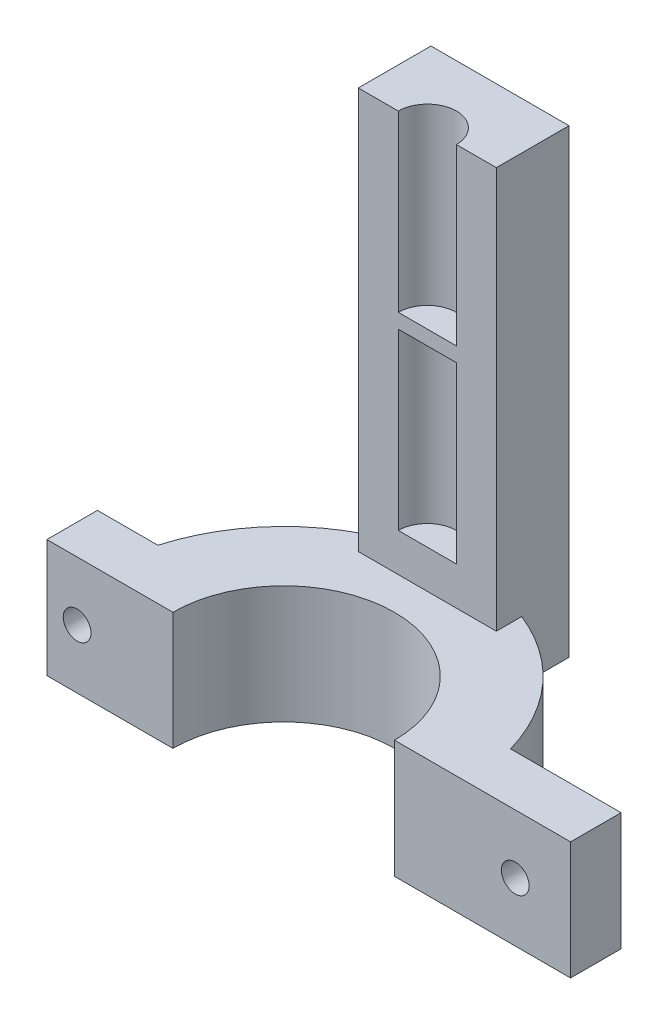
ISO-10303-21;
HEADER;
FILE_DESCRIPTION(('STEP AP214'),'2;1');
FILE_NAME('part.step','',(''),(''),'','','');
FILE_SCHEMA(('AUTOMOTIVE_DESIGN { 1 0 10303 214 1 1 1 1 }'));
ENDSEC;
DATA;
#1=APPLICATION_CONTEXT('core data for automotive mechanical design processes');
#2=APPLICATION_PROTOCOL_DEFINITION('international standard','automotive_design',2000,#1);
#3=PRODUCT_CONTEXT('',#1,'mechanical');
#4=PRODUCT('Part','Part','',(#3));
#5=PRODUCT_RELATED_PRODUCT_CATEGORY('part','',(#4));
#6=PRODUCT_DEFINITION_FORMATION('','',#4);
#7=PRODUCT_DEFINITION_CONTEXT('part definition',#1,'design');
#8=PRODUCT_DEFINITION('design','',#6,#7);
#9=PRODUCT_DEFINITION_SHAPE('','',#8);
#10=(LENGTH_UNIT() NAMED_UNIT(*) SI_UNIT(.MILLI.,.METRE.));
#11=(NAMED_UNIT(*) PLANE_ANGLE_UNIT() SI_UNIT($,.RADIAN.));
#12=(NAMED_UNIT(*) SI_UNIT($,.STERADIAN.) SOLID_ANGLE_UNIT());
#13=UNCERTAINTY_MEASURE_WITH_UNIT(LENGTH_MEASURE(1.E-05),#10,'distance_accuracy_value','');
#14=(GEOMETRIC_REPRESENTATION_CONTEXT(3) GLOBAL_UNCERTAINTY_ASSIGNED_CONTEXT((#13)) GLOBAL_UNIT_ASSIGNED_CONTEXT((#10,
#11,#12)) REPRESENTATION_CONTEXT('',''));
#15=CARTESIAN_POINT('',(0.,0.,0.));
#16=DIRECTION('',(0.,0.,1.));
#17=DIRECTION('',(1.,0.,0.));
#18=AXIS2_PLACEMENT_3D('',#15,#16,#17);
#19=CARTESIAN_POINT('',(-14.35,-74.82,0.));
#20=DIRECTION('',(0.,1.,0.));
#21=DIRECTION('',(0.,0.,1.));
#22=AXIS2_PLACEMENT_3D('',#19,#20,#21);
#23=CYLINDRICAL_SURFACE('',#22,25.25);
#24=CARTESIAN_POINT('',(-14.35,-66.705,0.));
#25=DIRECTION('',(0.,1.,0.));
#26=DIRECTION('',(0.,0.,1.));
#27=AXIS2_PLACEMENT_3D('',#24,#25,#26);
#28=CIRCLE('',#27,25.25);
#29=CARTESIAN_POINT('',(-24.0767539253605,-66.705,-23.3013467008987));
#30=VERTEX_POINT('',#29);
#31=CARTESIAN_POINT('',(-5.07675392536054,-66.705,-23.4855148387082));
#32=VERTEX_POINT('',#31);
#33=EDGE_CURVE('E103',#30,#32,#28,.F.);
#34=ORIENTED_EDGE('',*,*,#33,.T.);
#35=DIRECTION('',(0.,1.,0.));
#36=VECTOR('',#35,1.);
#37=CARTESIAN_POINT('',(-5.07675392536053,-74.82,-23.4855148387082));
#38=LINE('',#37,#36);
#39=CARTESIAN_POINT('',(-5.07675392536054,-58.59,-23.4855148387082));
#40=VERTEX_POINT('',#39);
#41=EDGE_CURVE('E264',#32,#40,#38,.T.);
#42=ORIENTED_EDGE('',*,*,#41,.T.);
#43=CARTESIAN_POINT('',(-14.35,-58.59,0.));
#44=DIRECTION('',(0.,1.,0.));
#45=DIRECTION('',(1.,0.,0.));
#46=AXIS2_PLACEMENT_3D('',#43,#44,#45);
#47=CIRCLE('',#46,25.25);
#48=CARTESIAN_POINT('',(9.92324607463947,-58.59,-6.955));
#49=VERTEX_POINT('',#48);
#50=EDGE_CURVE('E320',#49,#40,#47,.T.);
#51=ORIENTED_EDGE('',*,*,#50,.F.);
#52=DIRECTION('',(0.,1.,0.));
#53=VECTOR('',#52,1.);
#54=CARTESIAN_POINT('',(9.92324607463947,-74.82,-6.95500000000001));
#55=LINE('',#54,#53);
#56=CARTESIAN_POINT('',(9.92324607463947,-74.82,-6.955));
#57=VERTEX_POINT('',#56);
#58=EDGE_CURVE('E319',#57,#49,#55,.T.);
#59=ORIENTED_EDGE('',*,*,#58,.F.);
#60=CARTESIAN_POINT('',(-14.35,-74.82,0.));
#61=DIRECTION('',(0.,1.,0.));
#62=DIRECTION('',(1.,0.,0.));
#63=AXIS2_PLACEMENT_3D('',#60,#61,#62);
#64=CIRCLE('',#63,25.25);
#65=CARTESIAN_POINT('',(-38.6232460746395,-74.82,-6.955));
#66=VERTEX_POINT('',#65);
#67=EDGE_CURVE('E316',#57,#66,#64,.T.);
#68=ORIENTED_EDGE('',*,*,#67,.T.);
#69=DIRECTION('',(0.,1.,0.));
#70=VECTOR('',#69,1.);
#71=CARTESIAN_POINT('',(-38.6232460746395,-74.82,-6.955));
#72=LINE('',#71,#70);
#73=CARTESIAN_POINT('',(-38.6232460746395,-58.59,-6.955));
#74=VERTEX_POINT('',#73);
#75=EDGE_CURVE('E335',#74,#66,#72,.F.);
#76=ORIENTED_EDGE('',*,*,#75,.F.);
#77=CARTESIAN_POINT('',(-24.0767539253605,-58.59,-23.3013467008987));
#78=VERTEX_POINT('',#77);
#79=EDGE_CURVE('E313',#78,#74,#47,.T.);
#80=ORIENTED_EDGE('',*,*,#79,.F.);
#81=DIRECTION('',(0.,1.,0.));
#82=VECTOR('',#81,1.);
#83=CARTESIAN_POINT('',(-24.0767539253605,-74.82,-23.3013467008987));
#84=LINE('',#83,#82);
#85=EDGE_CURVE('E262',#78,#30,#84,.F.);
#86=ORIENTED_EDGE('',*,*,#85,.T.);
#87=EDGE_LOOP('',(#34,#42,#51,#59,#68,#76,#80,#86));
#88=FACE_BOUND('',#87,.T.);
#89=ADVANCED_FACE('F80',(#88),#23,.T.);
#90=CARTESIAN_POINT('',(9.92000000000001,-58.59,-6.955));
#91=DIRECTION('',(0.,-1.,0.));
#92=DIRECTION('',(0.,0.,-1.));
#93=AXIS2_PLACEMENT_3D('',#90,#91,#92);
#94=PLANE('',#93);
#95=DIRECTION('',(0.,0.,-1.));
#96=VECTOR('',#95,1.);
#97=CARTESIAN_POINT('',(-5.07675392536054,-58.59,-6.955));
#98=LINE('',#97,#96);
#99=CARTESIAN_POINT('',(-5.07675392536054,-58.59,-20.));
#100=VERTEX_POINT('',#99);
#101=EDGE_CURVE('E347',#100,#40,#98,.T.);
#102=ORIENTED_EDGE('',*,*,#101,.F.);
#103=DIRECTION('',(1.,0.,0.));
#104=VECTOR('',#103,1.);
#105=CARTESIAN_POINT('',(9.92000000000001,-58.59,-20.));
#106=LINE('',#105,#104);
#107=CARTESIAN_POINT('',(-24.0767539253605,-58.59,-20.));
#108=VERTEX_POINT('',#107);
#109=EDGE_CURVE('E341',#108,#100,#106,.T.);
#110=ORIENTED_EDGE('',*,*,#109,.F.);
#111=DIRECTION('',(0.,0.,1.));
#112=VECTOR('',#111,1.);
#113=CARTESIAN_POINT('',(-24.0767539253605,-58.59,-6.955));
#114=LINE('',#113,#112);
#115=EDGE_CURVE('E344',#78,#108,#114,.T.);
#116=ORIENTED_EDGE('',*,*,#115,.F.);
#117=ORIENTED_EDGE('',*,*,#79,.T.);
#118=DIRECTION('',(1.,0.,0.));
#119=VECTOR('',#118,1.);
#120=CARTESIAN_POINT('',(-50.,-58.59,-6.955));
#121=LINE('',#120,#119);
#122=CARTESIAN_POINT('',(-46.9432460746395,-58.59,-6.955));
#123=VERTEX_POINT('',#122);
#124=EDGE_CURVE('E303',#123,#74,#121,.T.);
#125=ORIENTED_EDGE('',*,*,#124,.F.);
#126=DIRECTION('',(0.,0.,-1.));
#127=VECTOR('',#126,1.);
#128=CARTESIAN_POINT('',(-46.9432460746395,-58.59,25.25));
#129=LINE('',#128,#127);
#130=CARTESIAN_POINT('',(-46.9432460746395,-58.59,0.));
#131=VERTEX_POINT('',#130);
#132=EDGE_CURVE('E300',#131,#123,#129,.T.);
#133=ORIENTED_EDGE('',*,*,#132,.F.);
#134=DIRECTION('',(-1.,0.,0.));
#135=VECTOR('',#134,1.);
#136=CARTESIAN_POINT('',(25.14,-58.59,0.));
#137=LINE('',#136,#135);
#138=CARTESIAN_POINT('',(-29.6,-58.59,0.));
#139=VERTEX_POINT('',#138);
#140=EDGE_CURVE('E266',#139,#131,#137,.T.);
#141=ORIENTED_EDGE('',*,*,#140,.F.);
#142=CARTESIAN_POINT('',(-14.35,-58.59,0.));
#143=DIRECTION('',(0.,1.,0.));
#144=DIRECTION('',(0.,0.,1.));
#145=AXIS2_PLACEMENT_3D('',#142,#143,#144);
#146=CIRCLE('',#145,15.25);
#147=CARTESIAN_POINT('',(0.900000000000007,-58.59,0.));
#148=VERTEX_POINT('',#147);
#149=EDGE_CURVE('E307',#148,#139,#146,.T.);
#150=ORIENTED_EDGE('',*,*,#149,.F.);
#151=CARTESIAN_POINT('',(25.14,-58.59,0.));
#152=VERTEX_POINT('',#151);
#153=EDGE_CURVE('E267',#152,#148,#137,.T.);
#154=ORIENTED_EDGE('',*,*,#153,.F.);
#155=DIRECTION('',(0.,0.,-1.));
#156=VECTOR('',#155,1.);
#157=CARTESIAN_POINT('',(25.14,-58.59,-6.955));
#158=LINE('',#157,#156);
#159=CARTESIAN_POINT('',(25.14,-58.59,-6.955));
#160=VERTEX_POINT('',#159);
#161=EDGE_CURVE('E327',#152,#160,#158,.T.);
#162=ORIENTED_EDGE('',*,*,#161,.T.);
#163=DIRECTION('',(1.,0.,0.));
#164=VECTOR('',#163,1.);
#165=CARTESIAN_POINT('',(9.92000000000001,-58.59,-6.955));
#166=LINE('',#165,#164);
#167=EDGE_CURVE('E329',#49,#160,#166,.T.);
#168=ORIENTED_EDGE('',*,*,#167,.F.);
#169=ORIENTED_EDGE('',*,*,#50,.T.);
#170=EDGE_LOOP('',(#102,#110,#116,#117,#125,#133,#141,#150,#154,#162,#168,#169));
#171=FACE_BOUND('',#170,.T.);
#172=ADVANCED_FACE('F376',(#171),#94,.F.);
#173=CARTESIAN_POINT('',(38.14,5.74573636502059,-6.955));
#174=DIRECTION('',(0.,0.,1.));
#175=DIRECTION('',(0.,-1.,0.));
#176=AXIS2_PLACEMENT_3D('',#173,#174,#175);
#177=PLANE('',#176);
#178=CARTESIAN_POINT('',(17.5248952643869,-66.705,-6.95500000000001));
#179=DIRECTION('',(0.,0.,-1.));
#180=DIRECTION('',(0.,1.,0.));
#181=AXIS2_PLACEMENT_3D('',#178,#179,#180);
#182=CIRCLE('',#181,1.91);
#183=CARTESIAN_POINT('',(17.5248952643869,-64.795,-6.95500000000001));
#184=VERTEX_POINT('',#183);
#185=EDGE_CURVE('E324',#184,#184,#182,.T.);
#186=ORIENTED_EDGE('',*,*,#185,.F.);
#187=EDGE_LOOP('',(#186));
#188=FACE_BOUND('',#187,.T.);
#189=ORIENTED_EDGE('',*,*,#167,.T.);
#190=DIRECTION('',(0.,-1.,0.));
#191=VECTOR('',#190,1.);
#192=CARTESIAN_POINT('',(25.14,5.74573636502059,-6.955));
#193=LINE('',#192,#191);
#194=CARTESIAN_POINT('',(25.14,-74.82,-6.95500000000001));
#195=VERTEX_POINT('',#194);
#196=EDGE_CURVE('E288',#160,#195,#193,.T.);
#197=ORIENTED_EDGE('',*,*,#196,.T.);
#198=DIRECTION('',(1.,0.,0.));
#199=VECTOR('',#198,1.);
#200=CARTESIAN_POINT('',(38.14,-74.82,-6.955));
#201=LINE('',#200,#199);
#202=EDGE_CURVE('E332',#57,#195,#201,.T.);
#203=ORIENTED_EDGE('',*,*,#202,.F.);
#204=ORIENTED_EDGE('',*,*,#58,.T.);
#205=EDGE_LOOP('',(#189,#197,#203,#204));
#206=FACE_BOUND('',#205,.T.);
#207=ADVANCED_FACE('F82',(#188,#206),#177,.F.);
#208=CARTESIAN_POINT('',(0.,-74.82,0.));
#209=DIRECTION('',(0.,1.,0.));
#210=DIRECTION('',(0.,0.,1.));
#211=AXIS2_PLACEMENT_3D('',#208,#209,#210);
#212=PLANE('',#211);
#213=DIRECTION('',(0.,0.,1.));
#214=VECTOR('',#213,1.);
#215=CARTESIAN_POINT('',(25.14,-74.82,0.));
#216=LINE('',#215,#214);
#217=CARTESIAN_POINT('',(25.14,-74.82,0.));
#218=VERTEX_POINT('',#217);
#219=EDGE_CURVE('E291',#195,#218,#216,.T.);
#220=ORIENTED_EDGE('',*,*,#219,.T.);
#221=DIRECTION('',(-1.,0.,0.));
#222=VECTOR('',#221,1.);
#223=CARTESIAN_POINT('',(0.,-74.82,0.));
#224=LINE('',#223,#222);
#225=CARTESIAN_POINT('',(0.900000000000005,-74.82,0.));
#226=VERTEX_POINT('',#225);
#227=EDGE_CURVE('E279',#218,#226,#224,.T.);
#228=ORIENTED_EDGE('',*,*,#227,.T.);
#229=CARTESIAN_POINT('',(-14.35,-74.82,0.));
#230=DIRECTION('',(0.,1.,0.));
#231=DIRECTION('',(0.,0.,1.));
#232=AXIS2_PLACEMENT_3D('',#229,#230,#231);
#233=CIRCLE('',#232,15.25);
#234=CARTESIAN_POINT('',(-29.6,-74.82,0.));
#235=VERTEX_POINT('',#234);
#236=EDGE_CURVE('E310',#226,#235,#233,.T.);
#237=ORIENTED_EDGE('',*,*,#236,.T.);
#238=CARTESIAN_POINT('',(-46.9432460746395,-74.82,0.));
#239=VERTEX_POINT('',#238);
#240=EDGE_CURVE('E275',#235,#239,#224,.T.);
#241=ORIENTED_EDGE('',*,*,#240,.T.);
#242=DIRECTION('',(0.,0.,-1.));
#243=VECTOR('',#242,1.);
#244=CARTESIAN_POINT('',(-46.9432460746395,-74.82,25.25));
#245=LINE('',#244,#243);
#246=CARTESIAN_POINT('',(-46.9432460746395,-74.82,-6.955));
#247=VERTEX_POINT('',#246);
#248=EDGE_CURVE('E301',#239,#247,#245,.T.);
#249=ORIENTED_EDGE('',*,*,#248,.T.);
#250=DIRECTION('',(1.,0.,0.));
#251=VECTOR('',#250,1.);
#252=CARTESIAN_POINT('',(-50.,-74.82,-6.955));
#253=LINE('',#252,#251);
#254=EDGE_CURVE('E305',#247,#66,#253,.T.);
#255=ORIENTED_EDGE('',*,*,#254,.T.);
#256=ORIENTED_EDGE('',*,*,#67,.F.);
#257=ORIENTED_EDGE('',*,*,#202,.T.);
#258=EDGE_LOOP('',(#220,#228,#237,#241,#249,#255,#256,#257));
#259=FACE_BOUND('',#258,.T.);
#260=ADVANCED_FACE('F389',(#259),#212,.F.);
#261=CARTESIAN_POINT('',(17.5248952643869,-66.705,8.26499999999999));
#262=DIRECTION('',(0.,0.,-1.));
#263=DIRECTION('',(0.,1.,0.));
#264=AXIS2_PLACEMENT_3D('',#261,#262,#263);
#265=CYLINDRICAL_SURFACE('',#264,1.91);
#266=CARTESIAN_POINT('',(17.5248952643869,-66.705,0.));
#267=DIRECTION('',(0.,0.,-1.));
#268=DIRECTION('',(-1.,0.,0.));
#269=AXIS2_PLACEMENT_3D('',#266,#267,#268);
#270=CIRCLE('',#269,1.91);
#271=CARTESIAN_POINT('',(15.6148952643869,-66.705,0.));
#272=VERTEX_POINT('',#271);
#273=EDGE_CURVE('E285',#272,#272,#270,.F.);
#274=ORIENTED_EDGE('',*,*,#273,.T.);
#275=EDGE_LOOP('',(#274));
#276=FACE_BOUND('',#275,.T.);
#277=ORIENTED_EDGE('',*,*,#185,.T.);
#278=EDGE_LOOP('',(#277));
#279=FACE_BOUND('',#278,.T.);
#280=ADVANCED_FACE('F387',(#276,#279),#265,.F.);
#281=CARTESIAN_POINT('',(-14.35,-74.82,0.));
#282=DIRECTION('',(0.,1.,0.));
#283=DIRECTION('',(0.,0.,1.));
#284=AXIS2_PLACEMENT_3D('',#281,#282,#283);
#285=CYLINDRICAL_SURFACE('',#284,15.25);
#286=ORIENTED_EDGE('',*,*,#149,.T.);
#287=DIRECTION('',(0.,1.,0.));
#288=VECTOR('',#287,1.);
#289=CARTESIAN_POINT('',(-29.6,-74.82,0.));
#290=LINE('',#289,#288);
#291=EDGE_CURVE('E278',#139,#235,#290,.F.);
#292=ORIENTED_EDGE('',*,*,#291,.T.);
#293=ORIENTED_EDGE('',*,*,#236,.F.);
#294=DIRECTION('',(0.,1.,0.));
#295=VECTOR('',#294,1.);
#296=CARTESIAN_POINT('',(0.900000000000005,-74.82,0.));
#297=LINE('',#296,#295);
#298=EDGE_CURVE('E282',#226,#148,#297,.T.);
#299=ORIENTED_EDGE('',*,*,#298,.T.);
#300=EDGE_LOOP('',(#286,#292,#293,#299));
#301=FACE_BOUND('',#300,.T.);
#302=ADVANCED_FACE('F385',(#301),#285,.F.);
#303=CARTESIAN_POINT('',(-50.,-58.59,-6.955));
#304=DIRECTION('',(0.,0.,-1.));
#305=DIRECTION('',(-1.,0.,0.));
#306=AXIS2_PLACEMENT_3D('',#303,#304,#305);
#307=PLANE('',#306);
#308=CARTESIAN_POINT('',(-42.7865081517211,-66.705,-6.955));
#309=DIRECTION('',(0.,0.,-1.));
#310=DIRECTION('',(-1.,0.,0.));
#311=AXIS2_PLACEMENT_3D('',#308,#309,#310);
#312=CIRCLE('',#311,1.91);
#313=CARTESIAN_POINT('',(-44.6965081517211,-66.705,-6.955));
#314=VERTEX_POINT('',#313);
#315=EDGE_CURVE('E294',#314,#314,#312,.T.);
#316=ORIENTED_EDGE('',*,*,#315,.F.);
#317=EDGE_LOOP('',(#316));
#318=FACE_BOUND('',#317,.T.);
#319=DIRECTION('',(0.,-1.,0.));
#320=VECTOR('',#319,1.);
#321=CARTESIAN_POINT('',(-46.9432460746395,-74.82,-6.955));
#322=LINE('',#321,#320);
#323=EDGE_CURVE('E297',#123,#247,#322,.T.);
#324=ORIENTED_EDGE('',*,*,#323,.F.);
#325=ORIENTED_EDGE('',*,*,#124,.T.);
#326=ORIENTED_EDGE('',*,*,#75,.T.);
#327=ORIENTED_EDGE('',*,*,#254,.F.);
#328=EDGE_LOOP('',(#324,#325,#326,#327));
#329=FACE_BOUND('',#328,.T.);
#330=ADVANCED_FACE('F432',(#318,#329),#307,.T.);
#331=CARTESIAN_POINT('',(-46.9432460746395,-74.82,25.25));
#332=DIRECTION('',(1.,0.,0.));
#333=DIRECTION('',(0.,0.,-1.));
#334=AXIS2_PLACEMENT_3D('',#331,#332,#333);
#335=PLANE('',#334);
#336=ORIENTED_EDGE('',*,*,#248,.F.);
#337=DIRECTION('',(0.,1.,0.));
#338=VECTOR('',#337,1.);
#339=CARTESIAN_POINT('',(-46.9432460746395,-74.82,0.));
#340=LINE('',#339,#338);
#341=EDGE_CURVE('E272',#239,#131,#340,.T.);
#342=ORIENTED_EDGE('',*,*,#341,.T.);
#343=ORIENTED_EDGE('',*,*,#132,.T.);
#344=ORIENTED_EDGE('',*,*,#323,.T.);
#345=EDGE_LOOP('',(#336,#342,#343,#344));
#346=FACE_BOUND('',#345,.T.);
#347=ADVANCED_FACE('F436',(#346),#335,.F.);
#348=CARTESIAN_POINT('',(-42.7865081517211,-66.705,25.25));
#349=DIRECTION('',(0.,0.,-1.));
#350=DIRECTION('',(-1.,0.,0.));
#351=AXIS2_PLACEMENT_3D('',#348,#349,#350);
#352=CYLINDRICAL_SURFACE('',#351,1.91);
#353=CARTESIAN_POINT('',(-42.7865081517211,-66.705,0.));
#354=DIRECTION('',(0.,0.,-1.));
#355=DIRECTION('',(-1.,0.,0.));
#356=AXIS2_PLACEMENT_3D('',#353,#354,#355);
#357=CIRCLE('',#356,1.91);
#358=CARTESIAN_POINT('',(-44.6965081517211,-66.705,0.));
#359=VERTEX_POINT('',#358);
#360=EDGE_CURVE('E269',#359,#359,#357,.F.);
#361=ORIENTED_EDGE('',*,*,#360,.T.);
#362=EDGE_LOOP('',(#361));
#363=FACE_BOUND('',#362,.T.);
#364=ORIENTED_EDGE('',*,*,#315,.T.);
#365=EDGE_LOOP('',(#364));
#366=FACE_BOUND('',#365,.T.);
#367=ADVANCED_FACE('F455',(#363,#366),#352,.F.);
#368=CARTESIAN_POINT('',(25.14,-58.59,-25.25));
#369=DIRECTION('',(-1.,0.,0.));
#370=DIRECTION('',(0.,0.,1.));
#371=AXIS2_PLACEMENT_3D('',#368,#369,#370);
#372=PLANE('',#371);
#373=ORIENTED_EDGE('',*,*,#161,.F.);
#374=DIRECTION('',(0.,-1.,0.));
#375=VECTOR('',#374,1.);
#376=CARTESIAN_POINT('',(25.14,-58.59,0.));
#377=LINE('',#376,#375);
#378=EDGE_CURVE('E338',#152,#218,#377,.T.);
#379=ORIENTED_EDGE('',*,*,#378,.T.);
#380=ORIENTED_EDGE('',*,*,#219,.F.);
#381=ORIENTED_EDGE('',*,*,#196,.F.);
#382=EDGE_LOOP('',(#373,#379,#380,#381));
#383=FACE_BOUND('',#382,.T.);
#384=ADVANCED_FACE('F403',(#383),#372,.F.);
#385=CARTESIAN_POINT('',(25.14,-118.59,0.));
#386=DIRECTION('',(0.,0.,-1.));
#387=DIRECTION('',(-1.,0.,0.));
#388=AXIS2_PLACEMENT_3D('',#385,#386,#387);
#389=PLANE('',#388);
#390=ORIENTED_EDGE('',*,*,#378,.F.);
#391=ORIENTED_EDGE('',*,*,#153,.T.);
#392=ORIENTED_EDGE('',*,*,#298,.F.);
#393=ORIENTED_EDGE('',*,*,#227,.F.);
#394=EDGE_LOOP('',(#390,#391,#392,#393));
#395=FACE_BOUND('',#394,.T.);
#396=ORIENTED_EDGE('',*,*,#273,.F.);
#397=EDGE_LOOP('',(#396));
#398=FACE_BOUND('',#397,.T.);
#399=ADVANCED_FACE('F442',(#395,#398),#389,.F.);
#400=ORIENTED_EDGE('',*,*,#360,.F.);
#401=EDGE_LOOP('',(#400));
#402=FACE_BOUND('',#401,.T.);
#403=ORIENTED_EDGE('',*,*,#140,.T.);
#404=ORIENTED_EDGE('',*,*,#341,.F.);
#405=ORIENTED_EDGE('',*,*,#240,.F.);
#406=ORIENTED_EDGE('',*,*,#291,.F.);
#407=EDGE_LOOP('',(#403,#404,#405,#406));
#408=FACE_BOUND('',#407,.T.);
#409=ADVANCED_FACE('F445',(#402,#408),#389,.F.);
#410=CARTESIAN_POINT('',(0.,0.,-20.));
#411=DIRECTION('',(0.,0.,-1.));
#412=DIRECTION('',(-1.,0.,0.));
#413=AXIS2_PLACEMENT_3D('',#410,#411,#412);
#414=PLANE('',#413);
#415=DIRECTION('',(1.,0.,0.));
#416=VECTOR('',#415,1.);
#417=CARTESIAN_POINT('',(0.,-27.325,-20.));
#418=LINE('',#417,#416);
#419=CARTESIAN_POINT('',(-18.5767539253605,-27.325,-20.));
#420=VERTEX_POINT('',#419);
#421=CARTESIAN_POINT('',(-10.5767539253605,-27.325,-20.));
#422=VERTEX_POINT('',#421);
#423=EDGE_CURVE('E14',#420,#422,#418,.T.);
#424=ORIENTED_EDGE('',*,*,#423,.F.);
#425=DIRECTION('',(0.,1.,0.));
#426=VECTOR('',#425,1.);
#427=CARTESIAN_POINT('',(-18.5767539253605,-27.325,-20.));
#428=LINE('',#427,#426);
#429=CARTESIAN_POINT('',(-18.5767539253605,-3.325,-20.));
#430=VERTEX_POINT('',#429);
#431=EDGE_CURVE('E203',#420,#430,#428,.T.);
#432=ORIENTED_EDGE('',*,*,#431,.T.);
#433=DIRECTION('',(1.,0.,0.));
#434=VECTOR('',#433,1.);
#435=CARTESIAN_POINT('',(-5.07675392536055,-3.32499999999999,-20.));
#436=LINE('',#435,#434);
#437=CARTESIAN_POINT('',(-24.0767539253605,-3.325,-20.));
#438=VERTEX_POINT('',#437);
#439=EDGE_CURVE('E232',#438,#430,#436,.T.);
#440=ORIENTED_EDGE('',*,*,#439,.F.);
#441=DIRECTION('',(0.,-1.,0.));
#442=VECTOR('',#441,1.);
#443=CARTESIAN_POINT('',(-24.0767539253605,-29.325,-20.));
#444=LINE('',#443,#442);
#445=EDGE_CURVE('E248',#438,#108,#444,.T.);
#446=ORIENTED_EDGE('',*,*,#445,.T.);
#447=ORIENTED_EDGE('',*,*,#109,.T.);
#448=DIRECTION('',(0.,1.,0.));
#449=VECTOR('',#448,1.);
#450=CARTESIAN_POINT('',(-5.07675392536054,-29.325,-20.));
#451=LINE('',#450,#449);
#452=CARTESIAN_POINT('',(-5.07675392536055,-3.32499999999999,-20.));
#453=VERTEX_POINT('',#452);
#454=EDGE_CURVE('E246',#100,#453,#451,.T.);
#455=ORIENTED_EDGE('',*,*,#454,.T.);
#456=CARTESIAN_POINT('',(-10.5767539253605,-3.325,-20.));
#457=VERTEX_POINT('',#456);
#458=EDGE_CURVE('E220',#457,#453,#436,.T.);
#459=ORIENTED_EDGE('',*,*,#458,.F.);
#460=DIRECTION('',(0.,1.,0.));
#461=VECTOR('',#460,1.);
#462=CARTESIAN_POINT('',(-10.5767539253605,-27.325,-20.));
#463=LINE('',#462,#461);
#464=EDGE_CURVE('E95',#457,#422,#463,.F.);
#465=ORIENTED_EDGE('',*,*,#464,.T.);
#466=EDGE_LOOP('',(#424,#432,#440,#446,#447,#455,#459,#465));
#467=FACE_BOUND('',#466,.T.);
#468=DIRECTION('',(1.,0.,0.));
#469=VECTOR('',#468,1.);
#470=CARTESIAN_POINT('',(0.,-53.325,-20.));
#471=LINE('',#470,#469);
#472=CARTESIAN_POINT('',(-18.5767539253605,-53.325,-20.));
#473=VERTEX_POINT('',#472);
#474=CARTESIAN_POINT('',(-10.5767539253605,-53.325,-20.));
#475=VERTEX_POINT('',#474);
#476=EDGE_CURVE('E354',#473,#475,#471,.T.);
#477=ORIENTED_EDGE('',*,*,#476,.F.);
#478=DIRECTION('',(0.,1.,0.));
#479=VECTOR('',#478,1.);
#480=CARTESIAN_POINT('',(-18.5767539253605,-53.325,-20.));
#481=LINE('',#480,#479);
#482=CARTESIAN_POINT('',(-18.5767539253605,-29.325,-20.));
#483=VERTEX_POINT('',#482);
#484=EDGE_CURVE('E242',#473,#483,#481,.T.);
#485=ORIENTED_EDGE('',*,*,#484,.T.);
#486=DIRECTION('',(1.,0.,0.));
#487=VECTOR('',#486,1.);
#488=CARTESIAN_POINT('',(-5.07675392536054,-29.325,-20.));
#489=LINE('',#488,#487);
#490=CARTESIAN_POINT('',(-10.5767539253605,-29.325,-20.));
#491=VERTEX_POINT('',#490);
#492=EDGE_CURVE('E211',#483,#491,#489,.T.);
#493=ORIENTED_EDGE('',*,*,#492,.T.);
#494=DIRECTION('',(0.,1.,0.));
#495=VECTOR('',#494,1.);
#496=CARTESIAN_POINT('',(-10.5767539253605,-53.325,-20.));
#497=LINE('',#496,#495);
#498=EDGE_CURVE('E239',#491,#475,#497,.F.);
#499=ORIENTED_EDGE('',*,*,#498,.T.);
#500=EDGE_LOOP('',(#477,#485,#493,#499));
#501=FACE_BOUND('',#500,.T.);
#502=ADVANCED_FACE('F216',(#467,#501),#414,.F.);
#503=CARTESIAN_POINT('',(-5.07675392536054,-29.325,-20.));
#504=DIRECTION('',(-1.,0.,0.));
#505=DIRECTION('',(0.,-1.,0.));
#506=AXIS2_PLACEMENT_3D('',#503,#504,#505);
#507=PLANE('',#506);
#508=ORIENTED_EDGE('',*,*,#41,.F.);
#509=DIRECTION('',(0.,0.,-1.));
#510=VECTOR('',#509,1.);
#511=CARTESIAN_POINT('',(-5.07675392536054,-66.705,-20.));
#512=LINE('',#511,#510);
#513=CARTESIAN_POINT('',(-5.07675392536054,-66.705,-30.));
#514=VERTEX_POINT('',#513);
#515=EDGE_CURVE('E252',#32,#514,#512,.T.);
#516=ORIENTED_EDGE('',*,*,#515,.T.);
#517=DIRECTION('',(0.,1.,0.));
#518=VECTOR('',#517,1.);
#519=CARTESIAN_POINT('',(-5.07675392536054,-29.325,-30.));
#520=LINE('',#519,#518);
#521=CARTESIAN_POINT('',(-5.07675392536055,-3.32499999999999,-30.));
#522=VERTEX_POINT('',#521);
#523=EDGE_CURVE('E245',#514,#522,#520,.T.);
#524=ORIENTED_EDGE('',*,*,#523,.T.);
#525=DIRECTION('',(0.,0.,-1.));
#526=VECTOR('',#525,1.);
#527=CARTESIAN_POINT('',(-5.07675392536055,-3.32499999999999,-20.));
#528=LINE('',#527,#526);
#529=EDGE_CURVE('E223',#453,#522,#528,.T.);
#530=ORIENTED_EDGE('',*,*,#529,.F.);
#531=ORIENTED_EDGE('',*,*,#454,.F.);
#532=ORIENTED_EDGE('',*,*,#101,.T.);
#533=EDGE_LOOP('',(#508,#516,#524,#530,#531,#532));
#534=FACE_BOUND('',#533,.T.);
#535=ADVANCED_FACE('F411',(#534),#507,.F.);
#536=CARTESIAN_POINT('',(-24.0767539253605,-29.325,-20.));
#537=DIRECTION('',(1.,0.,0.));
#538=DIRECTION('',(0.,1.,0.));
#539=AXIS2_PLACEMENT_3D('',#536,#537,#538);
#540=PLANE('',#539);
#541=ORIENTED_EDGE('',*,*,#85,.F.);
#542=ORIENTED_EDGE('',*,*,#115,.T.);
#543=ORIENTED_EDGE('',*,*,#445,.F.);
#544=DIRECTION('',(0.,0.,1.));
#545=VECTOR('',#544,1.);
#546=CARTESIAN_POINT('',(-24.0767539253605,-3.325,-20.));
#547=LINE('',#546,#545);
#548=CARTESIAN_POINT('',(-24.0767539253605,-3.325,-30.));
#549=VERTEX_POINT('',#548);
#550=EDGE_CURVE('E229',#549,#438,#547,.T.);
#551=ORIENTED_EDGE('',*,*,#550,.F.);
#552=DIRECTION('',(0.,-1.,0.));
#553=VECTOR('',#552,1.);
#554=CARTESIAN_POINT('',(-24.0767539253605,-29.325,-30.));
#555=LINE('',#554,#553);
#556=CARTESIAN_POINT('',(-24.0767539253605,-66.705,-30.));
#557=VERTEX_POINT('',#556);
#558=EDGE_CURVE('E254',#549,#557,#555,.T.);
#559=ORIENTED_EDGE('',*,*,#558,.T.);
#560=DIRECTION('',(0.,0.,-1.));
#561=VECTOR('',#560,1.);
#562=CARTESIAN_POINT('',(-24.0767539253605,-66.705,-20.));
#563=LINE('',#562,#561);
#564=EDGE_CURVE('E260',#30,#557,#563,.T.);
#565=ORIENTED_EDGE('',*,*,#564,.F.);
#566=EDGE_LOOP('',(#541,#542,#543,#551,#559,#565));
#567=FACE_BOUND('',#566,.T.);
#568=ADVANCED_FACE('F426',(#567),#540,.F.);
#569=CARTESIAN_POINT('',(-5.07675392536054,-66.705,-20.));
#570=DIRECTION('',(0.,1.,0.));
#571=DIRECTION('',(0.,0.,1.));
#572=AXIS2_PLACEMENT_3D('',#569,#570,#571);
#573=PLANE('',#572);
#574=ORIENTED_EDGE('',*,*,#33,.F.);
#575=ORIENTED_EDGE('',*,*,#564,.T.);
#576=DIRECTION('',(1.,0.,0.));
#577=VECTOR('',#576,1.);
#578=CARTESIAN_POINT('',(-5.07675392536054,-66.705,-30.));
#579=LINE('',#578,#577);
#580=EDGE_CURVE('E249',#557,#514,#579,.T.);
#581=ORIENTED_EDGE('',*,*,#580,.T.);
#582=ORIENTED_EDGE('',*,*,#515,.F.);
#583=EDGE_LOOP('',(#574,#575,#581,#582));
#584=FACE_BOUND('',#583,.T.);
#585=ADVANCED_FACE('F414',(#584),#573,.F.);
#586=CARTESIAN_POINT('',(0.,0.,-30.));
#587=DIRECTION('',(0.,0.,-1.));
#588=DIRECTION('',(-1.,0.,0.));
#589=AXIS2_PLACEMENT_3D('',#586,#587,#588);
#590=PLANE('',#589);
#591=ORIENTED_EDGE('',*,*,#523,.F.);
#592=ORIENTED_EDGE('',*,*,#580,.F.);
#593=ORIENTED_EDGE('',*,*,#558,.F.);
#594=DIRECTION('',(-1.,0.,0.));
#595=VECTOR('',#594,1.);
#596=CARTESIAN_POINT('',(-5.07675392536055,-3.32499999999999,-30.));
#597=LINE('',#596,#595);
#598=EDGE_CURVE('E226',#522,#549,#597,.T.);
#599=ORIENTED_EDGE('',*,*,#598,.F.);
#600=EDGE_LOOP('',(#591,#592,#593,#599));
#601=FACE_BOUND('',#600,.T.);
#602=ADVANCED_FACE('F420',(#601),#590,.T.);
#603=CARTESIAN_POINT('',(-14.5767539253605,-53.325,-20.));
#604=DIRECTION('',(0.,1.,0.));
#605=DIRECTION('',(-1.,0.,0.));
#606=AXIS2_PLACEMENT_3D('',#603,#604,#605);
#607=PLANE('',#606);
#608=ORIENTED_EDGE('',*,*,#476,.T.);
#609=CARTESIAN_POINT('',(-14.5767539253605,-53.325,-20.));
#610=DIRECTION('',(0.,1.,0.));
#611=DIRECTION('',(-1.,0.,0.));
#612=AXIS2_PLACEMENT_3D('',#609,#610,#611);
#613=CIRCLE('',#612,4.);
#614=EDGE_CURVE('E234',#475,#473,#613,.T.);
#615=ORIENTED_EDGE('',*,*,#614,.T.);
#616=EDGE_LOOP('',(#608,#615));
#617=FACE_BOUND('',#616,.T.);
#618=ADVANCED_FACE('F358',(#617),#607,.T.);
#619=CARTESIAN_POINT('',(-14.5767539253605,-53.325,-20.));
#620=DIRECTION('',(0.,1.,0.));
#621=DIRECTION('',(-1.,0.,0.));
#622=AXIS2_PLACEMENT_3D('',#619,#620,#621);
#623=CYLINDRICAL_SURFACE('',#622,4.);
#624=ORIENTED_EDGE('',*,*,#614,.F.);
#625=ORIENTED_EDGE('',*,*,#498,.F.);
#626=CARTESIAN_POINT('',(-14.5767539253605,-29.325,-20.));
#627=DIRECTION('',(0.,-1.,0.));
#628=DIRECTION('',(1.,0.,0.));
#629=AXIS2_PLACEMENT_3D('',#626,#627,#628);
#630=CIRCLE('',#629,4.);
#631=EDGE_CURVE('E351',#483,#491,#630,.T.);
#632=ORIENTED_EDGE('',*,*,#631,.F.);
#633=ORIENTED_EDGE('',*,*,#484,.F.);
#634=EDGE_LOOP('',(#624,#625,#632,#633));
#635=FACE_BOUND('',#634,.T.);
#636=ADVANCED_FACE('F360',(#635),#623,.F.);
#637=CARTESIAN_POINT('',(0.,-29.325,0.));
#638=DIRECTION('',(0.,1.,0.));
#639=DIRECTION('',(-1.,0.,0.));
#640=AXIS2_PLACEMENT_3D('',#637,#638,#639);
#641=PLANE('',#640);
#642=ORIENTED_EDGE('',*,*,#492,.F.);
#643=ORIENTED_EDGE('',*,*,#631,.T.);
#644=EDGE_LOOP('',(#642,#643));
#645=FACE_BOUND('',#644,.T.);
#646=ADVANCED_FACE('F363',(#645),#641,.F.);
#647=CARTESIAN_POINT('',(0.,-3.32499999999999,0.));
#648=DIRECTION('',(0.,1.,0.));
#649=DIRECTION('',(-1.,0.,0.));
#650=AXIS2_PLACEMENT_3D('',#647,#648,#649);
#651=PLANE('',#650);
#652=CARTESIAN_POINT('',(-14.5767539253605,-3.325,-20.));
#653=DIRECTION('',(0.,1.,0.));
#654=DIRECTION('',(-1.,0.,0.));
#655=AXIS2_PLACEMENT_3D('',#652,#653,#654);
#656=CIRCLE('',#655,4.);
#657=EDGE_CURVE('E88',#457,#430,#656,.T.);
#658=ORIENTED_EDGE('',*,*,#657,.F.);
#659=ORIENTED_EDGE('',*,*,#458,.T.);
#660=ORIENTED_EDGE('',*,*,#529,.T.);
#661=ORIENTED_EDGE('',*,*,#598,.T.);
#662=ORIENTED_EDGE('',*,*,#550,.T.);
#663=ORIENTED_EDGE('',*,*,#439,.T.);
#664=EDGE_LOOP('',(#658,#659,#660,#661,#662,#663));
#665=FACE_BOUND('',#664,.T.);
#666=ADVANCED_FACE('F365',(#665),#651,.T.);
#667=CARTESIAN_POINT('',(-14.5767539253605,-27.325,-20.));
#668=DIRECTION('',(0.,1.,0.));
#669=DIRECTION('',(-1.,0.,0.));
#670=AXIS2_PLACEMENT_3D('',#667,#668,#669);
#671=PLANE('',#670);
#672=ORIENTED_EDGE('',*,*,#423,.T.);
#673=CARTESIAN_POINT('',(-14.5767539253605,-27.325,-20.));
#674=DIRECTION('',(0.,1.,0.));
#675=DIRECTION('',(-1.,0.,0.));
#676=AXIS2_PLACEMENT_3D('',#673,#674,#675);
#677=CIRCLE('',#676,4.);
#678=EDGE_CURVE('E206',#422,#420,#677,.T.);
#679=ORIENTED_EDGE('',*,*,#678,.T.);
#680=EDGE_LOOP('',(#672,#679));
#681=FACE_BOUND('',#680,.T.);
#682=ADVANCED_FACE('F214',(#681),#671,.T.);
#683=CARTESIAN_POINT('',(-14.5767539253605,-27.325,-20.));
#684=DIRECTION('',(0.,1.,0.));
#685=DIRECTION('',(-1.,0.,0.));
#686=AXIS2_PLACEMENT_3D('',#683,#684,#685);
#687=CYLINDRICAL_SURFACE('',#686,4.);
#688=ORIENTED_EDGE('',*,*,#678,.F.);
#689=ORIENTED_EDGE('',*,*,#464,.F.);
#690=ORIENTED_EDGE('',*,*,#657,.T.);
#691=ORIENTED_EDGE('',*,*,#431,.F.);
#692=EDGE_LOOP('',(#688,#689,#690,#691));
#693=FACE_BOUND('',#692,.T.);
#694=ADVANCED_FACE('F205',(#693),#687,.F.);
#695=CLOSED_SHELL('',(#89,#172,#207,#260,#280,#302,#330,#347,#367,#384,#399,#409,#502,#535,#568,
#585,#602,#618,#636,#646,#666,#682,#694));
#696=MANIFOLD_SOLID_BREP('B2',#695);
#697=ADVANCED_BREP_SHAPE_REPRESENTATION('',(#18,#696),#14);
#698=SHAPE_DEFINITION_REPRESENTATION(#9,#697);
ENDSEC;
END-ISO-10303-21;
